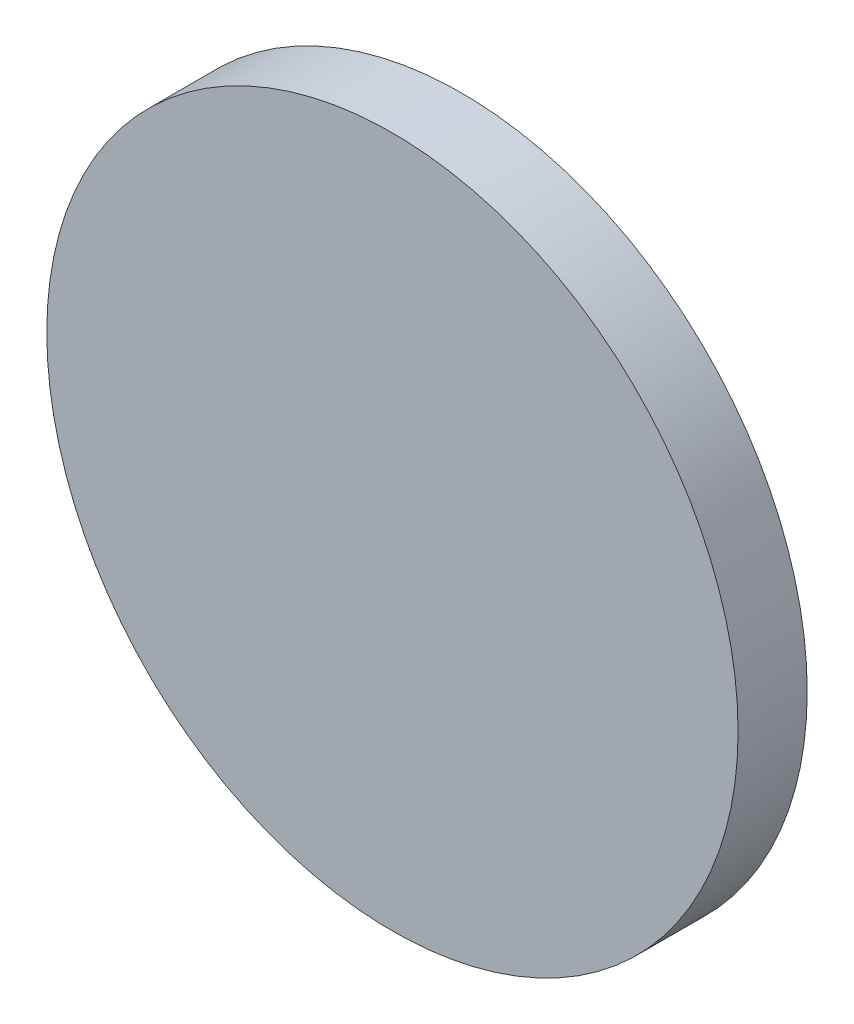
ISO-10303-21;
HEADER;
FILE_DESCRIPTION(('STEP AP214'),'2;1');
FILE_NAME('part.step','',(''),(''),'','','');
FILE_SCHEMA(('AUTOMOTIVE_DESIGN { 1 0 10303 214 1 1 1 1 }'));
ENDSEC;
DATA;
#1=APPLICATION_CONTEXT('core data for automotive mechanical design processes');
#2=APPLICATION_PROTOCOL_DEFINITION('international standard','automotive_design',2000,#1);
#3=PRODUCT_CONTEXT('',#1,'mechanical');
#4=PRODUCT('Part','Part','',(#3));
#5=PRODUCT_RELATED_PRODUCT_CATEGORY('part','',(#4));
#6=PRODUCT_DEFINITION_FORMATION('','',#4);
#7=PRODUCT_DEFINITION_CONTEXT('part definition',#1,'design');
#8=PRODUCT_DEFINITION('design','',#6,#7);
#9=PRODUCT_DEFINITION_SHAPE('','',#8);
#10=(LENGTH_UNIT() NAMED_UNIT(*) SI_UNIT(.MILLI.,.METRE.));
#11=(NAMED_UNIT(*) PLANE_ANGLE_UNIT() SI_UNIT($,.RADIAN.));
#12=(NAMED_UNIT(*) SI_UNIT($,.STERADIAN.) SOLID_ANGLE_UNIT());
#13=UNCERTAINTY_MEASURE_WITH_UNIT(LENGTH_MEASURE(1.E-05),#10,'distance_accuracy_value','');
#14=(GEOMETRIC_REPRESENTATION_CONTEXT(3) GLOBAL_UNCERTAINTY_ASSIGNED_CONTEXT((#13)) GLOBAL_UNIT_ASSIGNED_CONTEXT((#10,
#11,#12)) REPRESENTATION_CONTEXT('',''));
#15=CARTESIAN_POINT('',(0.,0.,0.));
#16=DIRECTION('',(0.,0.,1.));
#17=DIRECTION('',(1.,0.,0.));
#18=AXIS2_PLACEMENT_3D('',#15,#16,#17);
#19=CARTESIAN_POINT('',(0.,0.,10.));
#20=DIRECTION('',(0.,0.,-1.));
#21=DIRECTION('',(-1.,0.,0.));
#22=AXIS2_PLACEMENT_3D('',#19,#20,#21);
#23=CYLINDRICAL_SURFACE('',#22,50.);
#24=CARTESIAN_POINT('',(0.,0.,10.));
#25=DIRECTION('',(0.,0.,1.));
#26=DIRECTION('',(1.,0.,0.));
#27=AXIS2_PLACEMENT_3D('',#24,#25,#26);
#28=CIRCLE('',#27,50.);
#29=CARTESIAN_POINT('',(50.,0.,10.));
#30=VERTEX_POINT('',#29);
#31=EDGE_CURVE('E10',#30,#30,#28,.T.);
#32=ORIENTED_EDGE('',*,*,#31,.F.);
#33=EDGE_LOOP('',(#32));
#34=FACE_BOUND('',#33,.T.);
#35=CARTESIAN_POINT('',(0.,0.,0.));
#36=DIRECTION('',(0.,0.,1.));
#37=DIRECTION('',(1.,0.,0.));
#38=AXIS2_PLACEMENT_3D('',#35,#36,#37);
#39=CIRCLE('',#38,50.);
#40=CARTESIAN_POINT('',(50.,0.,0.));
#41=VERTEX_POINT('',#40);
#42=EDGE_CURVE('E33',#41,#41,#39,.T.);
#43=ORIENTED_EDGE('',*,*,#42,.T.);
#44=EDGE_LOOP('',(#43));
#45=FACE_BOUND('',#44,.T.);
#46=ADVANCED_FACE('F30',(#34,#45),#23,.T.);
#47=CARTESIAN_POINT('',(0.,0.,10.));
#48=DIRECTION('',(0.,0.,1.));
#49=DIRECTION('',(1.,0.,0.));
#50=AXIS2_PLACEMENT_3D('',#47,#48,#49);
#51=PLANE('',#50);
#52=ORIENTED_EDGE('',*,*,#31,.T.);
#53=EDGE_LOOP('',(#52));
#54=FACE_BOUND('',#53,.T.);
#55=ADVANCED_FACE('F45',(#54),#51,.T.);
#56=CARTESIAN_POINT('',(0.,0.,0.));
#57=DIRECTION('',(0.,0.,1.));
#58=DIRECTION('',(1.,0.,0.));
#59=AXIS2_PLACEMENT_3D('',#56,#57,#58);
#60=PLANE('',#59);
#61=ORIENTED_EDGE('',*,*,#42,.F.);
#62=EDGE_LOOP('',(#61));
#63=FACE_BOUND('',#62,.T.);
#64=ADVANCED_FACE('F43',(#63),#60,.F.);
#65=CLOSED_SHELL('',(#46,#55,#64));
#66=MANIFOLD_SOLID_BREP('B2',#65);
#67=ADVANCED_BREP_SHAPE_REPRESENTATION('',(#18,#66),#14);
#68=SHAPE_DEFINITION_REPRESENTATION(#9,#67);
ENDSEC;
END-ISO-10303-21;
